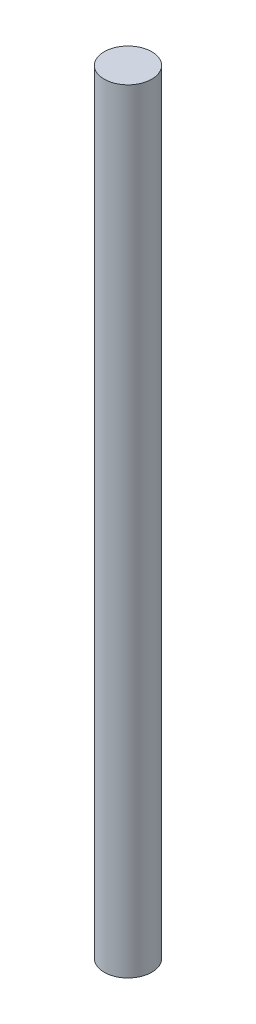
ISO-10303-21;
HEADER;
FILE_DESCRIPTION(('STEP AP214'),'2;1');
FILE_NAME('part.step','',(''),(''),'','','');
FILE_SCHEMA(('AUTOMOTIVE_DESIGN { 1 0 10303 214 1 1 1 1 }'));
ENDSEC;
DATA;
#1=APPLICATION_CONTEXT('core data for automotive mechanical design processes');
#2=APPLICATION_PROTOCOL_DEFINITION('international standard','automotive_design',2000,#1);
#3=PRODUCT_CONTEXT('',#1,'mechanical');
#4=PRODUCT('Part','Part','',(#3));
#5=PRODUCT_RELATED_PRODUCT_CATEGORY('part','',(#4));
#6=PRODUCT_DEFINITION_FORMATION('','',#4);
#7=PRODUCT_DEFINITION_CONTEXT('part definition',#1,'design');
#8=PRODUCT_DEFINITION('design','',#6,#7);
#9=PRODUCT_DEFINITION_SHAPE('','',#8);
#10=(LENGTH_UNIT() NAMED_UNIT(*) SI_UNIT(.MILLI.,.METRE.));
#11=(NAMED_UNIT(*) PLANE_ANGLE_UNIT() SI_UNIT($,.RADIAN.));
#12=(NAMED_UNIT(*) SI_UNIT($,.STERADIAN.) SOLID_ANGLE_UNIT());
#13=UNCERTAINTY_MEASURE_WITH_UNIT(LENGTH_MEASURE(1.E-05),#10,'distance_accuracy_value','');
#14=(GEOMETRIC_REPRESENTATION_CONTEXT(3) GLOBAL_UNCERTAINTY_ASSIGNED_CONTEXT((#13)) GLOBAL_UNIT_ASSIGNED_CONTEXT((#10,
#11,#12)) REPRESENTATION_CONTEXT('',''));
#15=CARTESIAN_POINT('',(0.,0.,0.));
#16=DIRECTION('',(0.,0.,1.));
#17=DIRECTION('',(1.,0.,0.));
#18=AXIS2_PLACEMENT_3D('',#15,#16,#17);
#19=CARTESIAN_POINT('',(0.,130.,0.));
#20=DIRECTION('',(0.,-1.,0.));
#21=DIRECTION('',(0.,0.,-1.));
#22=AXIS2_PLACEMENT_3D('',#19,#20,#21);
#23=CYLINDRICAL_SURFACE('',#22,4.);
#24=CARTESIAN_POINT('',(0.,130.,0.));
#25=DIRECTION('',(0.,1.,0.));
#26=DIRECTION('',(0.,0.,1.));
#27=AXIS2_PLACEMENT_3D('',#24,#25,#26);
#28=CIRCLE('',#27,4.);
#29=CARTESIAN_POINT('',(0.,130.,4.));
#30=VERTEX_POINT('',#29);
#31=EDGE_CURVE('E10',#30,#30,#28,.T.);
#32=ORIENTED_EDGE('',*,*,#31,.F.);
#33=EDGE_LOOP('',(#32));
#34=FACE_BOUND('',#33,.T.);
#35=CARTESIAN_POINT('',(0.,0.,0.));
#36=DIRECTION('',(0.,1.,0.));
#37=DIRECTION('',(0.,0.,1.));
#38=AXIS2_PLACEMENT_3D('',#35,#36,#37);
#39=CIRCLE('',#38,4.);
#40=CARTESIAN_POINT('',(0.,0.,4.));
#41=VERTEX_POINT('',#40);
#42=EDGE_CURVE('E46',#41,#41,#39,.T.);
#43=ORIENTED_EDGE('',*,*,#42,.T.);
#44=EDGE_LOOP('',(#43));
#45=FACE_BOUND('',#44,.T.);
#46=ADVANCED_FACE('F43',(#34,#45),#23,.T.);
#47=CARTESIAN_POINT('',(0.,130.,0.));
#48=DIRECTION('',(0.,1.,0.));
#49=DIRECTION('',(0.,0.,1.));
#50=AXIS2_PLACEMENT_3D('',#47,#48,#49);
#51=PLANE('',#50);
#52=ORIENTED_EDGE('',*,*,#31,.T.);
#53=EDGE_LOOP('',(#52));
#54=FACE_BOUND('',#53,.T.);
#55=ADVANCED_FACE('F60',(#54),#51,.T.);
#56=CARTESIAN_POINT('',(0.,0.,0.));
#57=DIRECTION('',(0.,1.,0.));
#58=DIRECTION('',(0.,0.,1.));
#59=AXIS2_PLACEMENT_3D('',#56,#57,#58);
#60=PLANE('',#59);
#61=ORIENTED_EDGE('',*,*,#42,.F.);
#62=EDGE_LOOP('',(#61));
#63=FACE_BOUND('',#62,.T.);
#64=ADVANCED_FACE('F58',(#63),#60,.F.);
#65=CLOSED_SHELL('',(#46,#55,#64));
#66=MANIFOLD_SOLID_BREP('B2',#65);
#67=ADVANCED_BREP_SHAPE_REPRESENTATION('',(#18,#66),#14);
#68=SHAPE_DEFINITION_REPRESENTATION(#9,#67);
ENDSEC;
END-ISO-10303-21;
